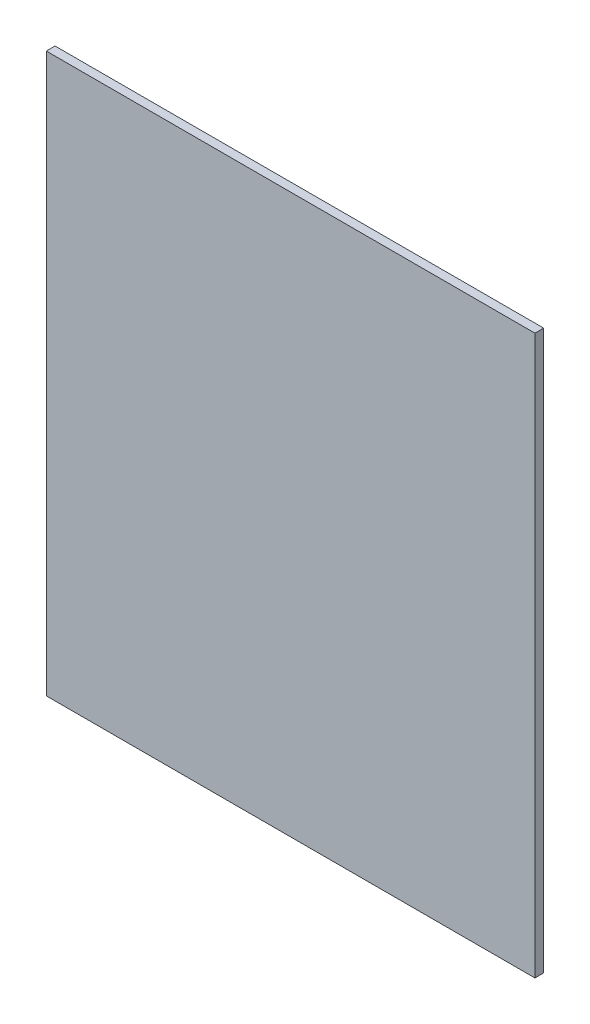
ISO-10303-21;
HEADER;
FILE_DESCRIPTION(('STEP AP214'),'2;1');
FILE_NAME('part.step','',(''),(''),'','','');
FILE_SCHEMA(('AUTOMOTIVE_DESIGN { 1 0 10303 214 1 1 1 1 }'));
ENDSEC;
DATA;
#1=APPLICATION_CONTEXT('core data for automotive mechanical design processes');
#2=APPLICATION_PROTOCOL_DEFINITION('international standard','automotive_design',2000,#1);
#3=PRODUCT_CONTEXT('',#1,'mechanical');
#4=PRODUCT('Part','Part','',(#3));
#5=PRODUCT_RELATED_PRODUCT_CATEGORY('part','',(#4));
#6=PRODUCT_DEFINITION_FORMATION('','',#4);
#7=PRODUCT_DEFINITION_CONTEXT('part definition',#1,'design');
#8=PRODUCT_DEFINITION('design','',#6,#7);
#9=PRODUCT_DEFINITION_SHAPE('','',#8);
#10=(LENGTH_UNIT() NAMED_UNIT(*) SI_UNIT(.MILLI.,.METRE.));
#11=(NAMED_UNIT(*) PLANE_ANGLE_UNIT() SI_UNIT($,.RADIAN.));
#12=(NAMED_UNIT(*) SI_UNIT($,.STERADIAN.) SOLID_ANGLE_UNIT());
#13=UNCERTAINTY_MEASURE_WITH_UNIT(LENGTH_MEASURE(1.E-05),#10,'distance_accuracy_value','');
#14=(GEOMETRIC_REPRESENTATION_CONTEXT(3) GLOBAL_UNCERTAINTY_ASSIGNED_CONTEXT((#13)) GLOBAL_UNIT_ASSIGNED_CONTEXT((#10,
#11,#12)) REPRESENTATION_CONTEXT('',''));
#15=CARTESIAN_POINT('',(0.,0.,0.));
#16=DIRECTION('',(0.,0.,1.));
#17=DIRECTION('',(1.,0.,0.));
#18=AXIS2_PLACEMENT_3D('',#15,#16,#17);
#19=CARTESIAN_POINT('',(-533.400000000008,609.599999999986,19.0499999999866));
#20=DIRECTION('',(1.00000000000003,0.,0.));
#21=DIRECTION('',(0.,0.999999999999986,0.));
#22=AXIS2_PLACEMENT_3D('',#19,#20,#21);
#23=PLANE('',#22);
#24=DIRECTION('',(0.,-0.999999999999985,0.));
#25=VECTOR('',#24,1.);
#26=CARTESIAN_POINT('',(-533.400000000008,609.599999999986,-1.34892097491957E-11));
#27=LINE('',#26,#25);
#28=CARTESIAN_POINT('',(-533.400000000008,609.599999999986,-1.34892097491957E-11));
#29=VERTEX_POINT('',#28);
#30=CARTESIAN_POINT('',(-533.400000000014,-609.599999999986,0.));
#31=VERTEX_POINT('',#30);
#32=EDGE_CURVE('E93',#29,#31,#27,.T.);
#33=ORIENTED_EDGE('',*,*,#32,.T.);
#34=DIRECTION('',(0.,0.,-1.));
#35=VECTOR('',#34,1.);
#36=CARTESIAN_POINT('',(-533.400000000014,-609.599999999986,19.05));
#37=LINE('',#36,#35);
#38=CARTESIAN_POINT('',(-533.400000000014,-609.599999999986,19.05));
#39=VERTEX_POINT('',#38);
#40=EDGE_CURVE('E11',#39,#31,#37,.T.);
#41=ORIENTED_EDGE('',*,*,#40,.F.);
#42=DIRECTION('',(0.,-0.999999999999985,0.));
#43=VECTOR('',#42,1.);
#44=CARTESIAN_POINT('',(-533.400000000008,609.599999999986,19.0499999999866));
#45=LINE('',#44,#43);
#46=CARTESIAN_POINT('',(-533.400000000008,609.599999999986,19.0499999999866));
#47=VERTEX_POINT('',#46);
#48=EDGE_CURVE('E81',#47,#39,#45,.T.);
#49=ORIENTED_EDGE('',*,*,#48,.F.);
#50=DIRECTION('',(0.,0.,-1.));
#51=VECTOR('',#50,1.);
#52=CARTESIAN_POINT('',(-533.400000000008,609.599999999986,19.0499999999866));
#53=LINE('',#52,#51);
#54=EDGE_CURVE('E89',#47,#29,#53,.T.);
#55=ORIENTED_EDGE('',*,*,#54,.T.);
#56=EDGE_LOOP('',(#33,#41,#49,#55));
#57=FACE_BOUND('',#56,.T.);
#58=ADVANCED_FACE('F30',(#57),#23,.F.);
#59=CARTESIAN_POINT('',(-533.400000000014,-609.599999999986,19.05));
#60=DIRECTION('',(0.,0.999999999999985,0.));
#61=DIRECTION('',(0.,0.,1.));
#62=AXIS2_PLACEMENT_3D('',#59,#60,#61);
#63=PLANE('',#62);
#64=DIRECTION('',(1.00000000000003,0.,0.));
#65=VECTOR('',#64,1.);
#66=CARTESIAN_POINT('',(-533.400000000014,-609.599999999986,0.));
#67=LINE('',#66,#65);
#68=CARTESIAN_POINT('',(533.400000000015,-609.599999999986,1.34336985979644E-11));
#69=VERTEX_POINT('',#68);
#70=EDGE_CURVE('E85',#31,#69,#67,.T.);
#71=ORIENTED_EDGE('',*,*,#70,.T.);
#72=DIRECTION('',(0.,0.,-1.));
#73=VECTOR('',#72,1.);
#74=CARTESIAN_POINT('',(533.400000000015,-609.599999999986,19.0500000000134));
#75=LINE('',#74,#73);
#76=CARTESIAN_POINT('',(533.400000000015,-609.599999999986,19.0500000000134));
#77=VERTEX_POINT('',#76);
#78=EDGE_CURVE('E38',#77,#69,#75,.T.);
#79=ORIENTED_EDGE('',*,*,#78,.F.);
#80=DIRECTION('',(1.00000000000003,0.,0.));
#81=VECTOR('',#80,1.);
#82=CARTESIAN_POINT('',(-533.400000000014,-609.599999999986,19.05));
#83=LINE('',#82,#81);
#84=EDGE_CURVE('E76',#39,#77,#83,.T.);
#85=ORIENTED_EDGE('',*,*,#84,.F.);
#86=ORIENTED_EDGE('',*,*,#40,.T.);
#87=EDGE_LOOP('',(#71,#79,#85,#86));
#88=FACE_BOUND('',#87,.T.);
#89=ADVANCED_FACE('F84',(#88),#63,.F.);
#90=CARTESIAN_POINT('',(533.400000000021,609.599999999986,19.05));
#91=DIRECTION('',(-1.00000000000003,0.,0.));
#92=DIRECTION('',(0.,-0.999999999999985,0.));
#93=AXIS2_PLACEMENT_3D('',#90,#91,#92);
#94=PLANE('',#93);
#95=DIRECTION('',(0.,0.999999999999986,0.));
#96=VECTOR('',#95,1.);
#97=CARTESIAN_POINT('',(533.400000000021,609.599999999986,-1.66533453693773E-13));
#98=LINE('',#97,#96);
#99=CARTESIAN_POINT('',(533.400000000021,609.599999999986,-1.66533453693773E-13));
#100=VERTEX_POINT('',#99);
#101=EDGE_CURVE('E63',#69,#100,#98,.T.);
#102=ORIENTED_EDGE('',*,*,#101,.T.);
#103=DIRECTION('',(0.,0.,-1.));
#104=VECTOR('',#103,1.);
#105=CARTESIAN_POINT('',(533.400000000021,609.599999999986,19.05));
#106=LINE('',#105,#104);
#107=CARTESIAN_POINT('',(533.400000000021,609.599999999986,19.05));
#108=VERTEX_POINT('',#107);
#109=EDGE_CURVE('E86',#108,#100,#106,.T.);
#110=ORIENTED_EDGE('',*,*,#109,.F.);
#111=DIRECTION('',(0.,0.999999999999986,0.));
#112=VECTOR('',#111,1.);
#113=CARTESIAN_POINT('',(533.400000000021,609.599999999986,19.05));
#114=LINE('',#113,#112);
#115=EDGE_CURVE('E79',#77,#108,#114,.T.);
#116=ORIENTED_EDGE('',*,*,#115,.F.);
#117=ORIENTED_EDGE('',*,*,#78,.T.);
#118=EDGE_LOOP('',(#102,#110,#116,#117));
#119=FACE_BOUND('',#118,.T.);
#120=ADVANCED_FACE('F87',(#119),#94,.F.);
#121=CARTESIAN_POINT('',(-533.400000000008,609.599999999986,19.0499999999866));
#122=DIRECTION('',(0.,-0.999999999999985,0.));
#123=DIRECTION('',(0.,0.,-1.));
#124=AXIS2_PLACEMENT_3D('',#121,#122,#123);
#125=PLANE('',#124);
#126=DIRECTION('',(-1.00000000000003,0.,0.));
#127=VECTOR('',#126,1.);
#128=CARTESIAN_POINT('',(-533.400000000008,609.599999999986,-1.34892097491957E-11));
#129=LINE('',#128,#127);
#130=EDGE_CURVE('E69',#100,#29,#129,.T.);
#131=ORIENTED_EDGE('',*,*,#130,.T.);
#132=ORIENTED_EDGE('',*,*,#54,.F.);
#133=DIRECTION('',(-1.00000000000003,0.,0.));
#134=VECTOR('',#133,1.);
#135=CARTESIAN_POINT('',(-533.400000000008,609.599999999986,19.0499999999866));
#136=LINE('',#135,#134);
#137=EDGE_CURVE('E46',#108,#47,#136,.T.);
#138=ORIENTED_EDGE('',*,*,#137,.F.);
#139=ORIENTED_EDGE('',*,*,#109,.T.);
#140=EDGE_LOOP('',(#131,#132,#138,#139));
#141=FACE_BOUND('',#140,.T.);
#142=ADVANCED_FACE('F100',(#141),#125,.F.);
#143=CARTESIAN_POINT('',(1.11022302462516E-13,-1.52655665885959E-13,19.05));
#144=DIRECTION('',(0.,0.,1.));
#145=DIRECTION('',(1.00000000000003,0.,0.));
#146=AXIS2_PLACEMENT_3D('',#143,#144,#145);
#147=PLANE('',#146);
#148=ORIENTED_EDGE('',*,*,#48,.T.);
#149=ORIENTED_EDGE('',*,*,#84,.T.);
#150=ORIENTED_EDGE('',*,*,#115,.T.);
#151=ORIENTED_EDGE('',*,*,#137,.T.);
#152=EDGE_LOOP('',(#148,#149,#150,#151));
#153=FACE_BOUND('',#152,.T.);
#154=ADVANCED_FACE('F77',(#153),#147,.T.);
#155=CARTESIAN_POINT('',(0.,0.,0.));
#156=DIRECTION('',(0.,0.,1.));
#157=DIRECTION('',(1.00000000000003,0.,0.));
#158=AXIS2_PLACEMENT_3D('',#155,#156,#157);
#159=PLANE('',#158);
#160=ORIENTED_EDGE('',*,*,#32,.F.);
#161=ORIENTED_EDGE('',*,*,#130,.F.);
#162=ORIENTED_EDGE('',*,*,#101,.F.);
#163=ORIENTED_EDGE('',*,*,#70,.F.);
#164=EDGE_LOOP('',(#160,#161,#162,#163));
#165=FACE_BOUND('',#164,.T.);
#166=ADVANCED_FACE('F103',(#165),#159,.F.);
#167=CLOSED_SHELL('',(#58,#89,#120,#142,#154,#166));
#168=MANIFOLD_SOLID_BREP('B2',#167);
#169=ADVANCED_BREP_SHAPE_REPRESENTATION('',(#18,#168),#14);
#170=SHAPE_DEFINITION_REPRESENTATION(#9,#169);
ENDSEC;
END-ISO-10303-21;
